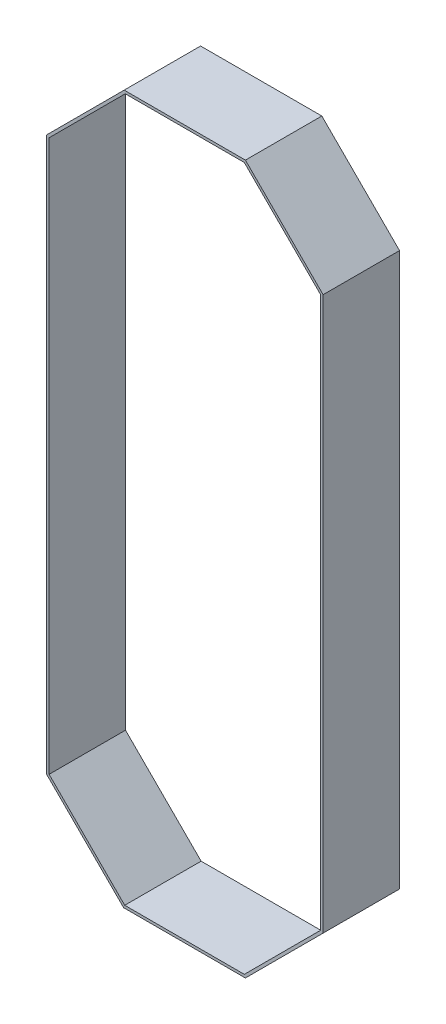
ISO-10303-21;
HEADER;
FILE_DESCRIPTION(('STEP AP214'),'2;1');
FILE_NAME('part.step','',(''),(''),'','','');
FILE_SCHEMA(('AUTOMOTIVE_DESIGN { 1 0 10303 214 1 1 1 1 }'));
ENDSEC;
DATA;
#1=APPLICATION_CONTEXT('core data for automotive mechanical design processes');
#2=APPLICATION_PROTOCOL_DEFINITION('international standard','automotive_design',2000,#1);
#3=PRODUCT_CONTEXT('',#1,'mechanical');
#4=PRODUCT('Part','Part','',(#3));
#5=PRODUCT_RELATED_PRODUCT_CATEGORY('part','',(#4));
#6=PRODUCT_DEFINITION_FORMATION('','',#4);
#7=PRODUCT_DEFINITION_CONTEXT('part definition',#1,'design');
#8=PRODUCT_DEFINITION('design','',#6,#7);
#9=PRODUCT_DEFINITION_SHAPE('','',#8);
#10=(LENGTH_UNIT() NAMED_UNIT(*) SI_UNIT(.MILLI.,.METRE.));
#11=(NAMED_UNIT(*) PLANE_ANGLE_UNIT() SI_UNIT($,.RADIAN.));
#12=(NAMED_UNIT(*) SI_UNIT($,.STERADIAN.) SOLID_ANGLE_UNIT());
#13=UNCERTAINTY_MEASURE_WITH_UNIT(LENGTH_MEASURE(1.E-05),#10,'distance_accuracy_value','');
#14=(GEOMETRIC_REPRESENTATION_CONTEXT(3) GLOBAL_UNCERTAINTY_ASSIGNED_CONTEXT((#13)) GLOBAL_UNIT_ASSIGNED_CONTEXT((#10,
#11,#12)) REPRESENTATION_CONTEXT('',''));
#15=CARTESIAN_POINT('',(0.,0.,0.));
#16=DIRECTION('',(0.,0.,1.));
#17=DIRECTION('',(1.,0.,0.));
#18=AXIS2_PLACEMENT_3D('',#15,#16,#17);
#19=CARTESIAN_POINT('',(46.1728553310847,103.211012114268,635.247388715728));
#20=DIRECTION('',(-0.707106781186548,0.707106781186547,0.));
#21=DIRECTION('',(-0.707106781186547,-0.707106781186548,0.));
#22=AXIS2_PLACEMENT_3D('',#19,#20,#21);
#23=PLANE('',#22);
#24=DIRECTION('',(0.707106781186547,0.707106781186548,0.));
#25=VECTOR('',#24,1.);
#26=CARTESIAN_POINT('',(46.1728553310845,103.211012114268,57.9999999428001));
#27=LINE('',#26,#25);
#28=CARTESIAN_POINT('',(46.1728553310847,103.211012114268,57.9999999428001));
#29=VERTEX_POINT('',#28);
#30=CARTESIAN_POINT('',(105.164634145912,162.202790929096,57.9999999428001));
#31=VERTEX_POINT('',#30);
#32=EDGE_CURVE('E350',#29,#31,#27,.T.);
#33=ORIENTED_EDGE('',*,*,#32,.F.);
#34=DIRECTION('',(0.,0.,-1.));
#35=VECTOR('',#34,1.);
#36=CARTESIAN_POINT('',(46.1728553310847,103.211012114268,635.247388715728));
#37=LINE('',#36,#35);
#38=CARTESIAN_POINT('',(46.1728553310847,103.211012114268,0.));
#39=VERTEX_POINT('',#38);
#40=EDGE_CURVE('E94',#29,#39,#37,.T.);
#41=ORIENTED_EDGE('',*,*,#40,.T.);
#42=DIRECTION('',(0.707106781186547,0.707106781186548,0.));
#43=VECTOR('',#42,1.);
#44=CARTESIAN_POINT('',(46.1728553310847,103.211012114268,0.));
#45=LINE('',#44,#43);
#46=CARTESIAN_POINT('',(105.164634145912,162.202790929096,0.));
#47=VERTEX_POINT('',#46);
#48=EDGE_CURVE('E245',#39,#47,#45,.T.);
#49=ORIENTED_EDGE('',*,*,#48,.T.);
#50=DIRECTION('',(0.,0.,-1.));
#51=VECTOR('',#50,1.);
#52=CARTESIAN_POINT('',(105.164634145912,162.202790929096,635.247388715728));
#53=LINE('',#52,#51);
#54=EDGE_CURVE('E248',#31,#47,#53,.T.);
#55=ORIENTED_EDGE('',*,*,#54,.F.);
#56=EDGE_LOOP('',(#33,#41,#49,#55));
#57=FACE_BOUND('',#56,.T.);
#58=ADVANCED_FACE('F79',(#57),#23,.F.);
#59=CARTESIAN_POINT('',(-46.2673867853923,103.211012114268,635.247388715728));
#60=DIRECTION('',(0.,1.,0.));
#61=DIRECTION('',(0.,0.,1.));
#62=AXIS2_PLACEMENT_3D('',#59,#60,#61);
#63=PLANE('',#62);
#64=DIRECTION('',(1.,0.,0.));
#65=VECTOR('',#64,1.);
#66=CARTESIAN_POINT('',(-46.2673867853926,103.211012114268,57.9999999428003));
#67=LINE('',#66,#65);
#68=CARTESIAN_POINT('',(-46.2673867853923,103.211012114268,57.9999999428003));
#69=VERTEX_POINT('',#68);
#70=EDGE_CURVE('E286',#69,#29,#67,.T.);
#71=ORIENTED_EDGE('',*,*,#70,.F.);
#72=DIRECTION('',(0.,0.,-1.));
#73=VECTOR('',#72,1.);
#74=CARTESIAN_POINT('',(-46.2673867853923,103.211012114268,635.247388715728));
#75=LINE('',#74,#73);
#76=CARTESIAN_POINT('',(-46.2673867853923,103.211012114268,0.));
#77=VERTEX_POINT('',#76);
#78=EDGE_CURVE('E251',#69,#77,#75,.T.);
#79=ORIENTED_EDGE('',*,*,#78,.T.);
#80=DIRECTION('',(1.,0.,0.));
#81=VECTOR('',#80,1.);
#82=CARTESIAN_POINT('',(-46.2673867853923,103.211012114268,0.));
#83=LINE('',#82,#81);
#84=EDGE_CURVE('E243',#77,#39,#83,.T.);
#85=ORIENTED_EDGE('',*,*,#84,.T.);
#86=ORIENTED_EDGE('',*,*,#40,.F.);
#87=EDGE_LOOP('',(#71,#79,#85,#86));
#88=FACE_BOUND('',#87,.T.);
#89=ADVANCED_FACE('F283',(#88),#63,.F.);
#90=CARTESIAN_POINT('',(-104.835365854088,161.778991182963,635.247388715728));
#91=DIRECTION('',(0.707106781186547,0.707106781186548,0.));
#92=DIRECTION('',(-0.707106781186548,0.707106781186547,0.));
#93=AXIS2_PLACEMENT_3D('',#90,#91,#92);
#94=PLANE('',#93);
#95=DIRECTION('',(0.707106781186548,-0.707106781186547,0.));
#96=VECTOR('',#95,1.);
#97=CARTESIAN_POINT('',(-104.835365854088,161.778991182964,57.9999999428003));
#98=LINE('',#97,#96);
#99=CARTESIAN_POINT('',(-104.835365854088,161.778991182963,57.9999999428003));
#100=VERTEX_POINT('',#99);
#101=EDGE_CURVE('E291',#100,#69,#98,.T.);
#102=ORIENTED_EDGE('',*,*,#101,.F.);
#103=DIRECTION('',(0.,0.,-1.));
#104=VECTOR('',#103,1.);
#105=CARTESIAN_POINT('',(-104.835365854088,161.778991182963,635.247388715728));
#106=LINE('',#105,#104);
#107=CARTESIAN_POINT('',(-104.835365854088,161.778991182963,0.));
#108=VERTEX_POINT('',#107);
#109=EDGE_CURVE('E253',#100,#108,#106,.T.);
#110=ORIENTED_EDGE('',*,*,#109,.T.);
#111=DIRECTION('',(0.707106781186548,-0.707106781186547,0.));
#112=VECTOR('',#111,1.);
#113=CARTESIAN_POINT('',(-104.835365854088,161.778991182963,0.));
#114=LINE('',#113,#112);
#115=EDGE_CURVE('E240',#108,#77,#114,.T.);
#116=ORIENTED_EDGE('',*,*,#115,.T.);
#117=ORIENTED_EDGE('',*,*,#78,.F.);
#118=EDGE_LOOP('',(#102,#110,#116,#117));
#119=FACE_BOUND('',#118,.T.);
#120=ADVANCED_FACE('F289',(#119),#94,.F.);
#121=CARTESIAN_POINT('',(-104.835365854088,581.921622857123,635.247388715728));
#122=DIRECTION('',(1.,0.,0.));
#123=DIRECTION('',(0.,0.,-1.));
#124=AXIS2_PLACEMENT_3D('',#121,#122,#123);
#125=PLANE('',#124);
#126=DIRECTION('',(0.,-1.,0.));
#127=VECTOR('',#126,1.);
#128=CARTESIAN_POINT('',(-104.835365854088,581.921622857123,57.9999999428003));
#129=LINE('',#128,#127);
#130=CARTESIAN_POINT('',(-104.835365854088,581.921622857123,57.9999999428003));
#131=VERTEX_POINT('',#130);
#132=EDGE_CURVE('E354',#131,#100,#129,.T.);
#133=ORIENTED_EDGE('',*,*,#132,.F.);
#134=DIRECTION('',(0.,0.,-1.));
#135=VECTOR('',#134,1.);
#136=CARTESIAN_POINT('',(-104.835365854088,581.921622857123,635.247388715728));
#137=LINE('',#136,#135);
#138=CARTESIAN_POINT('',(-104.835365854088,581.921622857123,0.));
#139=VERTEX_POINT('',#138);
#140=EDGE_CURVE('E255',#131,#139,#137,.T.);
#141=ORIENTED_EDGE('',*,*,#140,.T.);
#142=DIRECTION('',(0.,-1.,0.));
#143=VECTOR('',#142,1.);
#144=CARTESIAN_POINT('',(-104.835365854088,581.921622857123,0.));
#145=LINE('',#144,#143);
#146=EDGE_CURVE('E237',#139,#108,#145,.T.);
#147=ORIENTED_EDGE('',*,*,#146,.T.);
#148=ORIENTED_EDGE('',*,*,#109,.F.);
#149=EDGE_LOOP('',(#133,#141,#147,#148));
#150=FACE_BOUND('',#149,.T.);
#151=ADVANCED_FACE('F294',(#150),#125,.F.);
#152=CARTESIAN_POINT('',(-45.8522460726196,640.904742638591,635.247388715728));
#153=DIRECTION('',(0.707106781186548,-0.707106781186547,0.));
#154=DIRECTION('',(0.707106781186547,0.707106781186548,0.));
#155=AXIS2_PLACEMENT_3D('',#152,#153,#154);
#156=PLANE('',#155);
#157=DIRECTION('',(-0.707106781186547,-0.707106781186548,0.));
#158=VECTOR('',#157,1.);
#159=CARTESIAN_POINT('',(-45.8522460726198,640.904742638591,57.9999999428003));
#160=LINE('',#159,#158);
#161=CARTESIAN_POINT('',(-45.8522460726196,640.904742638591,57.9999999428003));
#162=VERTEX_POINT('',#161);
#163=EDGE_CURVE('E300',#162,#131,#160,.T.);
#164=ORIENTED_EDGE('',*,*,#163,.F.);
#165=DIRECTION('',(0.,0.,-1.));
#166=VECTOR('',#165,1.);
#167=CARTESIAN_POINT('',(-45.8522460726196,640.904742638591,635.247388715728));
#168=LINE('',#167,#166);
#169=CARTESIAN_POINT('',(-45.8522460726196,640.904742638591,0.));
#170=VERTEX_POINT('',#169);
#171=EDGE_CURVE('E257',#162,#170,#168,.T.);
#172=ORIENTED_EDGE('',*,*,#171,.T.);
#173=DIRECTION('',(-0.707106781186547,-0.707106781186548,0.));
#174=VECTOR('',#173,1.);
#175=CARTESIAN_POINT('',(-45.8522460726196,640.904742638591,0.));
#176=LINE('',#175,#174);
#177=EDGE_CURVE('E234',#170,#139,#176,.T.);
#178=ORIENTED_EDGE('',*,*,#177,.T.);
#179=ORIENTED_EDGE('',*,*,#140,.F.);
#180=EDGE_LOOP('',(#164,#172,#178,#179));
#181=FACE_BOUND('',#180,.T.);
#182=ADVANCED_FACE('F297',(#181),#156,.F.);
#183=CARTESIAN_POINT('',(46.1815143644441,640.904742638592,635.247388715728));
#184=DIRECTION('',(0.,-1.,0.));
#185=DIRECTION('',(1.,0.,0.));
#186=AXIS2_PLACEMENT_3D('',#183,#184,#185);
#187=PLANE('',#186);
#188=DIRECTION('',(-1.,0.,0.));
#189=VECTOR('',#188,1.);
#190=CARTESIAN_POINT('',(46.1815143644438,640.904742638592,57.9999999428001));
#191=LINE('',#190,#189);
#192=CARTESIAN_POINT('',(46.1815143644441,640.904742638592,57.9999999428001));
#193=VERTEX_POINT('',#192);
#194=EDGE_CURVE('E304',#193,#162,#191,.T.);
#195=ORIENTED_EDGE('',*,*,#194,.F.);
#196=DIRECTION('',(0.,0.,-1.));
#197=VECTOR('',#196,1.);
#198=CARTESIAN_POINT('',(46.1815143644441,640.904742638592,635.247388715728));
#199=LINE('',#198,#197);
#200=CARTESIAN_POINT('',(46.1815143644441,640.904742638592,0.));
#201=VERTEX_POINT('',#200);
#202=EDGE_CURVE('E259',#193,#201,#199,.T.);
#203=ORIENTED_EDGE('',*,*,#202,.T.);
#204=DIRECTION('',(-1.,0.,0.));
#205=VECTOR('',#204,1.);
#206=CARTESIAN_POINT('',(46.1815143644441,640.904742638592,0.));
#207=LINE('',#206,#205);
#208=EDGE_CURVE('E231',#201,#170,#207,.T.);
#209=ORIENTED_EDGE('',*,*,#208,.T.);
#210=ORIENTED_EDGE('',*,*,#171,.F.);
#211=EDGE_LOOP('',(#195,#203,#209,#210));
#212=FACE_BOUND('',#211,.T.);
#213=ADVANCED_FACE('F303',(#212),#187,.F.);
#214=CARTESIAN_POINT('',(105.164634145912,581.921622857123,635.247388715728));
#215=DIRECTION('',(-0.707106781186549,-0.707106781186546,0.));
#216=DIRECTION('',(0.707106781186546,-0.707106781186549,0.));
#217=AXIS2_PLACEMENT_3D('',#214,#215,#216);
#218=PLANE('',#217);
#219=DIRECTION('',(-0.707106781186546,0.707106781186549,0.));
#220=VECTOR('',#219,1.);
#221=CARTESIAN_POINT('',(105.164634145912,581.921622857123,57.9999999428001));
#222=LINE('',#221,#220);
#223=CARTESIAN_POINT('',(105.164634145912,581.921622857123,57.9999999428001));
#224=VERTEX_POINT('',#223);
#225=EDGE_CURVE('E267',#224,#193,#222,.T.);
#226=ORIENTED_EDGE('',*,*,#225,.F.);
#227=DIRECTION('',(0.,0.,-1.));
#228=VECTOR('',#227,1.);
#229=CARTESIAN_POINT('',(105.164634145912,581.921622857123,635.247388715728));
#230=LINE('',#229,#228);
#231=CARTESIAN_POINT('',(105.164634145912,581.921622857123,0.));
#232=VERTEX_POINT('',#231);
#233=EDGE_CURVE('E87',#224,#232,#230,.T.);
#234=ORIENTED_EDGE('',*,*,#233,.T.);
#235=DIRECTION('',(-0.707106781186546,0.707106781186549,0.));
#236=VECTOR('',#235,1.);
#237=CARTESIAN_POINT('',(105.164634145912,581.921622857123,0.));
#238=LINE('',#237,#236);
#239=EDGE_CURVE('E228',#232,#201,#238,.T.);
#240=ORIENTED_EDGE('',*,*,#239,.T.);
#241=ORIENTED_EDGE('',*,*,#202,.F.);
#242=EDGE_LOOP('',(#226,#234,#240,#241));
#243=FACE_BOUND('',#242,.T.);
#244=ADVANCED_FACE('F263',(#243),#218,.F.);
#245=CARTESIAN_POINT('',(105.164634145912,162.202790929096,635.247388715728));
#246=DIRECTION('',(-1.,0.,0.));
#247=DIRECTION('',(0.,-1.,0.));
#248=AXIS2_PLACEMENT_3D('',#245,#246,#247);
#249=PLANE('',#248);
#250=DIRECTION('',(0.,1.,0.));
#251=VECTOR('',#250,1.);
#252=CARTESIAN_POINT('',(105.164634145912,162.202790929096,57.9999999428001));
#253=LINE('',#252,#251);
#254=EDGE_CURVE('E277',#31,#224,#253,.T.);
#255=ORIENTED_EDGE('',*,*,#254,.F.);
#256=ORIENTED_EDGE('',*,*,#54,.T.);
#257=DIRECTION('',(0.,1.,0.));
#258=VECTOR('',#257,1.);
#259=CARTESIAN_POINT('',(105.164634145912,162.202790929096,0.));
#260=LINE('',#259,#258);
#261=EDGE_CURVE('E225',#47,#232,#260,.T.);
#262=ORIENTED_EDGE('',*,*,#261,.T.);
#263=ORIENTED_EDGE('',*,*,#233,.F.);
#264=EDGE_LOOP('',(#255,#256,#262,#263));
#265=FACE_BOUND('',#264,.T.);
#266=ADVANCED_FACE('F81',(#265),#249,.F.);
#267=CARTESIAN_POINT('',(105.164634145912,640.904742638592,0.));
#268=DIRECTION('',(0.,0.,1.));
#269=DIRECTION('',(1.,0.,0.));
#270=AXIS2_PLACEMENT_3D('',#267,#268,#269);
#271=PLANE('',#270);
#272=ORIENTED_EDGE('',*,*,#261,.F.);
#273=ORIENTED_EDGE('',*,*,#48,.F.);
#274=ORIENTED_EDGE('',*,*,#84,.F.);
#275=ORIENTED_EDGE('',*,*,#115,.F.);
#276=ORIENTED_EDGE('',*,*,#146,.F.);
#277=ORIENTED_EDGE('',*,*,#177,.F.);
#278=ORIENTED_EDGE('',*,*,#208,.F.);
#279=ORIENTED_EDGE('',*,*,#239,.F.);
#280=EDGE_LOOP('',(#272,#273,#274,#275,#276,#277,#278,#279));
#281=FACE_BOUND('',#280,.T.);
#282=DIRECTION('',(0.,1.,0.));
#283=VECTOR('',#282,1.);
#284=CARTESIAN_POINT('',(103.164634145912,162.202790929096,0.));
#285=LINE('',#284,#283);
#286=CARTESIAN_POINT('',(103.164634145912,163.031218053842,0.));
#287=VERTEX_POINT('',#286);
#288=CARTESIAN_POINT('',(103.164634145912,581.093195732377,0.));
#289=VERTEX_POINT('',#288);
#290=EDGE_CURVE('E306',#287,#289,#285,.T.);
#291=ORIENTED_EDGE('',*,*,#290,.T.);
#292=DIRECTION('',(-0.707106781186546,0.707106781186549,0.));
#293=VECTOR('',#292,1.);
#294=CARTESIAN_POINT('',(103.750420583539,580.50740929475,0.));
#295=LINE('',#294,#293);
#296=CARTESIAN_POINT('',(45.3530872396978,638.904742638592,0.));
#297=VERTEX_POINT('',#296);
#298=EDGE_CURVE('E313',#289,#297,#295,.T.);
#299=ORIENTED_EDGE('',*,*,#298,.T.);
#300=DIRECTION('',(-1.,0.,0.));
#301=VECTOR('',#300,1.);
#302=CARTESIAN_POINT('',(46.1815143644441,638.904742638592,0.));
#303=LINE('',#302,#301);
#304=CARTESIAN_POINT('',(-45.0238189478734,638.904742638591,0.));
#305=VERTEX_POINT('',#304);
#306=EDGE_CURVE('E316',#297,#305,#303,.T.);
#307=ORIENTED_EDGE('',*,*,#306,.T.);
#308=DIRECTION('',(-0.707106781186547,-0.707106781186548,0.));
#309=VECTOR('',#308,1.);
#310=CARTESIAN_POINT('',(-44.4380325102466,639.490529076218,0.));
#311=LINE('',#310,#309);
#312=CARTESIAN_POINT('',(-102.835365854088,581.093195732377,0.));
#313=VERTEX_POINT('',#312);
#314=EDGE_CURVE('E319',#305,#313,#311,.T.);
#315=ORIENTED_EDGE('',*,*,#314,.T.);
#316=DIRECTION('',(0.,-1.,0.));
#317=VECTOR('',#316,1.);
#318=CARTESIAN_POINT('',(-102.835365854088,581.921622857123,0.));
#319=LINE('',#318,#317);
#320=CARTESIAN_POINT('',(-102.835365854088,162.60741830771,0.));
#321=VERTEX_POINT('',#320);
#322=EDGE_CURVE('E322',#313,#321,#319,.T.);
#323=ORIENTED_EDGE('',*,*,#322,.T.);
#324=DIRECTION('',(0.707106781186548,-0.707106781186547,0.));
#325=VECTOR('',#324,1.);
#326=CARTESIAN_POINT('',(-103.421152291715,163.193204745337,0.));
#327=LINE('',#326,#325);
#328=CARTESIAN_POINT('',(-45.4389596606461,105.211012114268,0.));
#329=VERTEX_POINT('',#328);
#330=EDGE_CURVE('E325',#321,#329,#327,.T.);
#331=ORIENTED_EDGE('',*,*,#330,.T.);
#332=DIRECTION('',(1.,0.,0.));
#333=VECTOR('',#332,1.);
#334=CARTESIAN_POINT('',(-46.2673867853923,105.211012114268,0.));
#335=LINE('',#334,#333);
#336=CARTESIAN_POINT('',(45.3444282063385,105.211012114268,0.));
#337=VERTEX_POINT('',#336);
#338=EDGE_CURVE('E328',#329,#337,#335,.T.);
#339=ORIENTED_EDGE('',*,*,#338,.T.);
#340=DIRECTION('',(0.707106781186547,0.707106781186548,0.));
#341=VECTOR('',#340,1.);
#342=CARTESIAN_POINT('',(44.7586417687116,104.625225676641,0.));
#343=LINE('',#342,#341);
#344=EDGE_CURVE('E207',#337,#287,#343,.T.);
#345=ORIENTED_EDGE('',*,*,#344,.T.);
#346=EDGE_LOOP('',(#291,#299,#307,#315,#323,#331,#339,#345));
#347=FACE_BOUND('',#346,.T.);
#348=ADVANCED_FACE('F273',(#281,#347),#271,.F.);
#349=CARTESIAN_POINT('',(44.7586417687116,104.625225676641,635.247388715728));
#350=DIRECTION('',(-0.707106781186548,0.707106781186547,0.));
#351=DIRECTION('',(-0.707106781186547,-0.707106781186548,0.));
#352=AXIS2_PLACEMENT_3D('',#349,#350,#351);
#353=PLANE('',#352);
#354=DIRECTION('',(0.,0.,-1.));
#355=VECTOR('',#354,1.);
#356=CARTESIAN_POINT('',(45.3444282063385,105.211012114268,635.247388715728));
#357=LINE('',#356,#355);
#358=CARTESIAN_POINT('',(45.3444282063385,105.211012114268,57.9999999428001));
#359=VERTEX_POINT('',#358);
#360=EDGE_CURVE('E199',#359,#337,#357,.T.);
#361=ORIENTED_EDGE('',*,*,#360,.F.);
#362=DIRECTION('',(0.707106781186547,0.707106781186548,0.));
#363=VECTOR('',#362,1.);
#364=CARTESIAN_POINT('',(44.7586417687114,104.625225676641,57.9999999428001));
#365=LINE('',#364,#363);
#366=CARTESIAN_POINT('',(103.164634145912,163.031218053842,57.9999999428001));
#367=VERTEX_POINT('',#366);
#368=EDGE_CURVE('E12',#359,#367,#365,.T.);
#369=ORIENTED_EDGE('',*,*,#368,.T.);
#370=DIRECTION('',(0.,0.,-1.));
#371=VECTOR('',#370,1.);
#372=CARTESIAN_POINT('',(103.164634145912,163.031218053842,635.247388715728));
#373=LINE('',#372,#371);
#374=EDGE_CURVE('E209',#367,#287,#373,.T.);
#375=ORIENTED_EDGE('',*,*,#374,.T.);
#376=ORIENTED_EDGE('',*,*,#344,.F.);
#377=EDGE_LOOP('',(#361,#369,#375,#376));
#378=FACE_BOUND('',#377,.T.);
#379=ADVANCED_FACE('F205',(#378),#353,.T.);
#380=CARTESIAN_POINT('',(-46.2673867853923,105.211012114268,635.247388715728));
#381=DIRECTION('',(0.,1.,0.));
#382=DIRECTION('',(0.,0.,1.));
#383=AXIS2_PLACEMENT_3D('',#380,#381,#382);
#384=PLANE('',#383);
#385=DIRECTION('',(0.,0.,-1.));
#386=VECTOR('',#385,1.);
#387=CARTESIAN_POINT('',(-45.4389596606461,105.211012114268,635.247388715728));
#388=LINE('',#387,#386);
#389=CARTESIAN_POINT('',(-45.4389596606461,105.211012114268,57.9999999428003));
#390=VERTEX_POINT('',#389);
#391=EDGE_CURVE('E201',#390,#329,#388,.T.);
#392=ORIENTED_EDGE('',*,*,#391,.F.);
#393=DIRECTION('',(1.,0.,0.));
#394=VECTOR('',#393,1.);
#395=CARTESIAN_POINT('',(-46.2673867853926,105.211012114268,57.9999999428003));
#396=LINE('',#395,#394);
#397=EDGE_CURVE('E192',#390,#359,#396,.T.);
#398=ORIENTED_EDGE('',*,*,#397,.T.);
#399=ORIENTED_EDGE('',*,*,#360,.T.);
#400=ORIENTED_EDGE('',*,*,#338,.F.);
#401=EDGE_LOOP('',(#392,#398,#399,#400));
#402=FACE_BOUND('',#401,.T.);
#403=ADVANCED_FACE('F197',(#402),#384,.T.);
#404=CARTESIAN_POINT('',(-103.421152291715,163.193204745337,635.247388715728));
#405=DIRECTION('',(0.707106781186547,0.707106781186548,0.));
#406=DIRECTION('',(-0.707106781186548,0.707106781186547,0.));
#407=AXIS2_PLACEMENT_3D('',#404,#405,#406);
#408=PLANE('',#407);
#409=DIRECTION('',(0.,0.,-1.));
#410=VECTOR('',#409,1.);
#411=CARTESIAN_POINT('',(-102.835365854088,162.60741830771,635.247388715728));
#412=LINE('',#411,#410);
#413=CARTESIAN_POINT('',(-102.835365854088,162.60741830771,57.9999999428003));
#414=VERTEX_POINT('',#413);
#415=EDGE_CURVE('E211',#414,#321,#412,.T.);
#416=ORIENTED_EDGE('',*,*,#415,.F.);
#417=DIRECTION('',(0.707106781186548,-0.707106781186547,0.));
#418=VECTOR('',#417,1.);
#419=CARTESIAN_POINT('',(-103.421152291715,163.193204745337,57.9999999428003));
#420=LINE('',#419,#418);
#421=EDGE_CURVE('E203',#414,#390,#420,.T.);
#422=ORIENTED_EDGE('',*,*,#421,.T.);
#423=ORIENTED_EDGE('',*,*,#391,.T.);
#424=ORIENTED_EDGE('',*,*,#330,.F.);
#425=EDGE_LOOP('',(#416,#422,#423,#424));
#426=FACE_BOUND('',#425,.T.);
#427=ADVANCED_FACE('F334',(#426),#408,.T.);
#428=CARTESIAN_POINT('',(-102.835365854088,581.921622857123,635.247388715728));
#429=DIRECTION('',(1.,0.,0.));
#430=DIRECTION('',(0.,0.,-1.));
#431=AXIS2_PLACEMENT_3D('',#428,#429,#430);
#432=PLANE('',#431);
#433=DIRECTION('',(0.,0.,-1.));
#434=VECTOR('',#433,1.);
#435=CARTESIAN_POINT('',(-102.835365854088,581.093195732377,635.247388715728));
#436=LINE('',#435,#434);
#437=CARTESIAN_POINT('',(-102.835365854088,581.093195732377,57.9999999428003));
#438=VERTEX_POINT('',#437);
#439=EDGE_CURVE('E217',#438,#313,#436,.T.);
#440=ORIENTED_EDGE('',*,*,#439,.F.);
#441=DIRECTION('',(0.,-1.,0.));
#442=VECTOR('',#441,1.);
#443=CARTESIAN_POINT('',(-102.835365854088,581.921622857123,57.9999999428003));
#444=LINE('',#443,#442);
#445=EDGE_CURVE('E336',#438,#414,#444,.T.);
#446=ORIENTED_EDGE('',*,*,#445,.T.);
#447=ORIENTED_EDGE('',*,*,#415,.T.);
#448=ORIENTED_EDGE('',*,*,#322,.F.);
#449=EDGE_LOOP('',(#440,#446,#447,#448));
#450=FACE_BOUND('',#449,.T.);
#451=ADVANCED_FACE('F371',(#450),#432,.T.);
#452=CARTESIAN_POINT('',(-44.4380325102466,639.490529076218,635.247388715728));
#453=DIRECTION('',(0.707106781186548,-0.707106781186547,0.));
#454=DIRECTION('',(0.707106781186547,0.707106781186548,0.));
#455=AXIS2_PLACEMENT_3D('',#452,#453,#454);
#456=PLANE('',#455);
#457=DIRECTION('',(0.,0.,-1.));
#458=VECTOR('',#457,1.);
#459=CARTESIAN_POINT('',(-45.0238189478734,638.904742638591,635.247388715728));
#460=LINE('',#459,#458);
#461=CARTESIAN_POINT('',(-45.0238189478734,638.904742638591,57.9999999428003));
#462=VERTEX_POINT('',#461);
#463=EDGE_CURVE('E219',#462,#305,#460,.T.);
#464=ORIENTED_EDGE('',*,*,#463,.F.);
#465=DIRECTION('',(-0.707106781186547,-0.707106781186548,0.));
#466=VECTOR('',#465,1.);
#467=CARTESIAN_POINT('',(-44.4380325102467,639.490529076218,57.9999999428003));
#468=LINE('',#467,#466);
#469=EDGE_CURVE('E338',#462,#438,#468,.T.);
#470=ORIENTED_EDGE('',*,*,#469,.T.);
#471=ORIENTED_EDGE('',*,*,#439,.T.);
#472=ORIENTED_EDGE('',*,*,#314,.F.);
#473=EDGE_LOOP('',(#464,#470,#471,#472));
#474=FACE_BOUND('',#473,.T.);
#475=ADVANCED_FACE('F368',(#474),#456,.T.);
#476=CARTESIAN_POINT('',(46.1815143644441,638.904742638592,635.247388715728));
#477=DIRECTION('',(0.,-1.,0.));
#478=DIRECTION('',(1.,0.,0.));
#479=AXIS2_PLACEMENT_3D('',#476,#477,#478);
#480=PLANE('',#479);
#481=DIRECTION('',(0.,0.,-1.));
#482=VECTOR('',#481,1.);
#483=CARTESIAN_POINT('',(45.3530872396978,638.904742638592,635.247388715728));
#484=LINE('',#483,#482);
#485=CARTESIAN_POINT('',(45.3530872396978,638.904742638592,57.9999999428001));
#486=VERTEX_POINT('',#485);
#487=EDGE_CURVE('E221',#486,#297,#484,.T.);
#488=ORIENTED_EDGE('',*,*,#487,.F.);
#489=DIRECTION('',(-1.,0.,0.));
#490=VECTOR('',#489,1.);
#491=CARTESIAN_POINT('',(46.1815143644438,638.904742638592,57.9999999428001));
#492=LINE('',#491,#490);
#493=EDGE_CURVE('E343',#486,#462,#492,.T.);
#494=ORIENTED_EDGE('',*,*,#493,.T.);
#495=ORIENTED_EDGE('',*,*,#463,.T.);
#496=ORIENTED_EDGE('',*,*,#306,.F.);
#497=EDGE_LOOP('',(#488,#494,#495,#496));
#498=FACE_BOUND('',#497,.T.);
#499=ADVANCED_FACE('F365',(#498),#480,.T.);
#500=CARTESIAN_POINT('',(103.750420583539,580.50740929475,635.247388715728));
#501=DIRECTION('',(-0.707106781186549,-0.707106781186546,0.));
#502=DIRECTION('',(0.707106781186546,-0.707106781186549,0.));
#503=AXIS2_PLACEMENT_3D('',#500,#501,#502);
#504=PLANE('',#503);
#505=DIRECTION('',(0.,0.,-1.));
#506=VECTOR('',#505,1.);
#507=CARTESIAN_POINT('',(103.164634145912,581.093195732377,635.247388715728));
#508=LINE('',#507,#506);
#509=CARTESIAN_POINT('',(103.164634145912,581.093195732377,57.9999999428001));
#510=VERTEX_POINT('',#509);
#511=EDGE_CURVE('E223',#510,#289,#508,.T.);
#512=ORIENTED_EDGE('',*,*,#511,.F.);
#513=DIRECTION('',(-0.707106781186546,0.707106781186549,0.));
#514=VECTOR('',#513,1.);
#515=CARTESIAN_POINT('',(103.750420583539,580.50740929475,57.9999999428001));
#516=LINE('',#515,#514);
#517=EDGE_CURVE('E346',#510,#486,#516,.T.);
#518=ORIENTED_EDGE('',*,*,#517,.T.);
#519=ORIENTED_EDGE('',*,*,#487,.T.);
#520=ORIENTED_EDGE('',*,*,#298,.F.);
#521=EDGE_LOOP('',(#512,#518,#519,#520));
#522=FACE_BOUND('',#521,.T.);
#523=ADVANCED_FACE('F360',(#522),#504,.T.);
#524=CARTESIAN_POINT('',(103.164634145912,162.202790929096,635.247388715728));
#525=DIRECTION('',(-1.,0.,0.));
#526=DIRECTION('',(0.,-1.,0.));
#527=AXIS2_PLACEMENT_3D('',#524,#525,#526);
#528=PLANE('',#527);
#529=ORIENTED_EDGE('',*,*,#374,.F.);
#530=DIRECTION('',(0.,1.,0.));
#531=VECTOR('',#530,1.);
#532=CARTESIAN_POINT('',(103.164634145912,162.202790929096,57.9999999428001));
#533=LINE('',#532,#531);
#534=EDGE_CURVE('E102',#367,#510,#533,.T.);
#535=ORIENTED_EDGE('',*,*,#534,.T.);
#536=ORIENTED_EDGE('',*,*,#511,.T.);
#537=ORIENTED_EDGE('',*,*,#290,.F.);
#538=EDGE_LOOP('',(#529,#535,#536,#537));
#539=FACE_BOUND('',#538,.T.);
#540=ADVANCED_FACE('F356',(#539),#528,.T.);
#541=CARTESIAN_POINT('',(-104.988575808745,640.785981012006,57.9999999428002));
#542=DIRECTION('',(0.,0.,1.));
#543=DIRECTION('',(0.99999999357547,-0.000113353690289865,0.));
#544=AXIS2_PLACEMENT_3D('',#541,#542,#543);
#545=PLANE('',#544);
#546=ORIENTED_EDGE('',*,*,#534,.F.);
#547=ORIENTED_EDGE('',*,*,#368,.F.);
#548=ORIENTED_EDGE('',*,*,#397,.F.);
#549=ORIENTED_EDGE('',*,*,#421,.F.);
#550=ORIENTED_EDGE('',*,*,#445,.F.);
#551=ORIENTED_EDGE('',*,*,#469,.F.);
#552=ORIENTED_EDGE('',*,*,#493,.F.);
#553=ORIENTED_EDGE('',*,*,#517,.F.);
#554=EDGE_LOOP('',(#546,#547,#548,#549,#550,#551,#552,#553));
#555=FACE_BOUND('',#554,.T.);
#556=ORIENTED_EDGE('',*,*,#32,.T.);
#557=ORIENTED_EDGE('',*,*,#254,.T.);
#558=ORIENTED_EDGE('',*,*,#225,.T.);
#559=ORIENTED_EDGE('',*,*,#194,.T.);
#560=ORIENTED_EDGE('',*,*,#163,.T.);
#561=ORIENTED_EDGE('',*,*,#132,.T.);
#562=ORIENTED_EDGE('',*,*,#101,.T.);
#563=ORIENTED_EDGE('',*,*,#70,.T.);
#564=EDGE_LOOP('',(#556,#557,#558,#559,#560,#561,#562,#563));
#565=FACE_BOUND('',#564,.T.);
#566=ADVANCED_FACE('F190',(#555,#565),#545,.T.);
#567=CLOSED_SHELL('',(#58,#89,#120,#151,#182,#213,#244,#266,#348,#379,#403,#427,#451,#475,#499,
#523,#540,#566));
#568=MANIFOLD_SOLID_BREP('B2',#567);
#569=ADVANCED_BREP_SHAPE_REPRESENTATION('',(#18,#568),#14);
#570=SHAPE_DEFINITION_REPRESENTATION(#9,#569);
ENDSEC;
END-ISO-10303-21;
